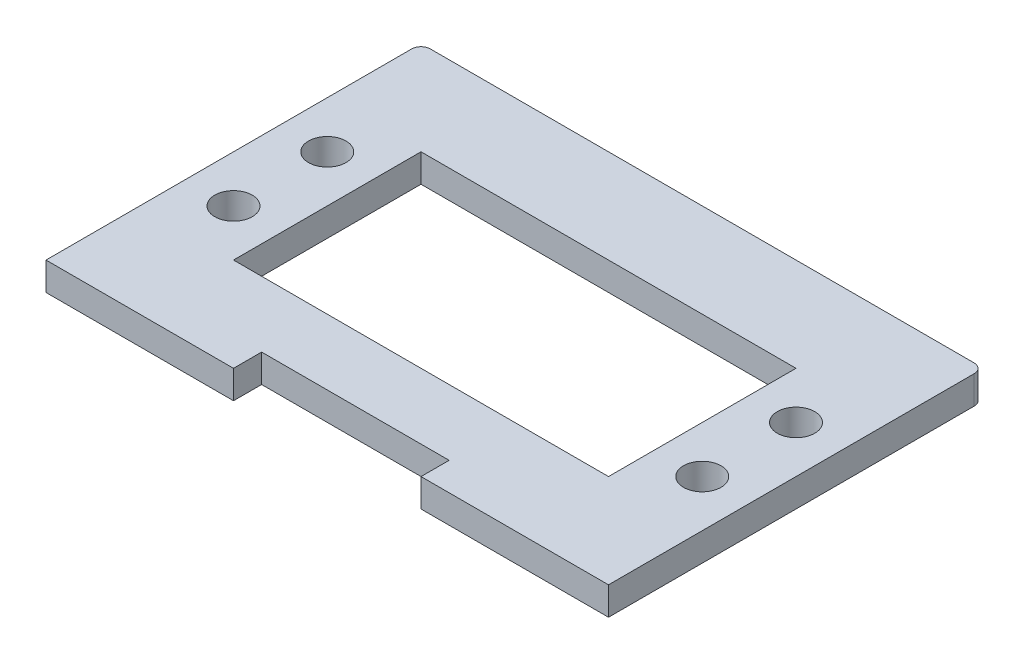
ISO-10303-21;
HEADER;
FILE_DESCRIPTION(('STEP AP214'),'2;1');
FILE_NAME('part.step','',(''),(''),'','','');
FILE_SCHEMA(('AUTOMOTIVE_DESIGN { 1 0 10303 214 1 1 1 1 }'));
ENDSEC;
DATA;
#1=APPLICATION_CONTEXT('core data for automotive mechanical design processes');
#2=APPLICATION_PROTOCOL_DEFINITION('international standard','automotive_design',2000,#1);
#3=PRODUCT_CONTEXT('',#1,'mechanical');
#4=PRODUCT('Part','Part','',(#3));
#5=PRODUCT_RELATED_PRODUCT_CATEGORY('part','',(#4));
#6=PRODUCT_DEFINITION_FORMATION('','',#4);
#7=PRODUCT_DEFINITION_CONTEXT('part definition',#1,'design');
#8=PRODUCT_DEFINITION('design','',#6,#7);
#9=PRODUCT_DEFINITION_SHAPE('','',#8);
#10=(LENGTH_UNIT() NAMED_UNIT(*) SI_UNIT(.MILLI.,.METRE.));
#11=(NAMED_UNIT(*) PLANE_ANGLE_UNIT() SI_UNIT($,.RADIAN.));
#12=(NAMED_UNIT(*) SI_UNIT($,.STERADIAN.) SOLID_ANGLE_UNIT());
#13=UNCERTAINTY_MEASURE_WITH_UNIT(LENGTH_MEASURE(1.E-05),#10,'distance_accuracy_value','');
#14=(GEOMETRIC_REPRESENTATION_CONTEXT(3) GLOBAL_UNCERTAINTY_ASSIGNED_CONTEXT((#13)) GLOBAL_UNIT_ASSIGNED_CONTEXT((#10,
#11,#12)) REPRESENTATION_CONTEXT('',''));
#15=CARTESIAN_POINT('',(0.,0.,0.));
#16=DIRECTION('',(0.,0.,1.));
#17=DIRECTION('',(1.,0.,0.));
#18=AXIS2_PLACEMENT_3D('',#15,#16,#17);
#19=CARTESIAN_POINT('',(30.,3.,20.));
#20=DIRECTION('',(0.,0.,-1.));
#21=DIRECTION('',(-1.,0.,0.));
#22=AXIS2_PLACEMENT_3D('',#19,#20,#21);
#23=PLANE('',#22);
#24=DIRECTION('',(1.,0.,0.));
#25=VECTOR('',#24,1.);
#26=CARTESIAN_POINT('',(30.,0.,20.));
#27=LINE('',#26,#25);
#28=CARTESIAN_POINT('',(-30.,0.,20.));
#29=VERTEX_POINT('',#28);
#30=CARTESIAN_POINT('',(-10.,0.,20.));
#31=VERTEX_POINT('',#30);
#32=EDGE_CURVE('E239',#29,#31,#27,.T.);
#33=ORIENTED_EDGE('',*,*,#32,.T.);
#34=DIRECTION('',(0.,1.,0.));
#35=VECTOR('',#34,1.);
#36=CARTESIAN_POINT('',(-10.,3.,20.));
#37=LINE('',#36,#35);
#38=CARTESIAN_POINT('',(-10.,3.,20.));
#39=VERTEX_POINT('',#38);
#40=EDGE_CURVE('E149',#31,#39,#37,.T.);
#41=ORIENTED_EDGE('',*,*,#40,.T.);
#42=DIRECTION('',(1.,0.,0.));
#43=VECTOR('',#42,1.);
#44=CARTESIAN_POINT('',(30.,3.,20.));
#45=LINE('',#44,#43);
#46=CARTESIAN_POINT('',(-30.,3.,20.));
#47=VERTEX_POINT('',#46);
#48=EDGE_CURVE('E228',#47,#39,#45,.T.);
#49=ORIENTED_EDGE('',*,*,#48,.F.);
#50=DIRECTION('',(0.,-1.,0.));
#51=VECTOR('',#50,1.);
#52=CARTESIAN_POINT('',(-30.,3.,20.));
#53=LINE('',#52,#51);
#54=EDGE_CURVE('E247',#47,#29,#53,.T.);
#55=ORIENTED_EDGE('',*,*,#54,.T.);
#56=EDGE_LOOP('',(#33,#41,#49,#55));
#57=FACE_BOUND('',#56,.T.);
#58=ADVANCED_FACE('F34',(#57),#23,.F.);
#59=CARTESIAN_POINT('',(-30.,3.,20.));
#60=DIRECTION('',(1.,0.,0.));
#61=DIRECTION('',(0.,0.,-1.));
#62=AXIS2_PLACEMENT_3D('',#59,#60,#61);
#63=PLANE('',#62);
#64=DIRECTION('',(0.,0.,1.));
#65=VECTOR('',#64,1.);
#66=CARTESIAN_POINT('',(-30.,3.,20.));
#67=LINE('',#66,#65);
#68=CARTESIAN_POINT('',(-30.,3.,-19.));
#69=VERTEX_POINT('',#68);
#70=EDGE_CURVE('E224',#69,#47,#67,.T.);
#71=ORIENTED_EDGE('',*,*,#70,.F.);
#72=DIRECTION('',(0.,-1.,0.));
#73=VECTOR('',#72,1.);
#74=CARTESIAN_POINT('',(-30.,3.,-19.));
#75=LINE('',#74,#73);
#76=CARTESIAN_POINT('',(-30.,0.,-19.));
#77=VERTEX_POINT('',#76);
#78=EDGE_CURVE('E250',#69,#77,#75,.T.);
#79=ORIENTED_EDGE('',*,*,#78,.T.);
#80=DIRECTION('',(0.,0.,1.));
#81=VECTOR('',#80,1.);
#82=CARTESIAN_POINT('',(-30.,0.,20.));
#83=LINE('',#82,#81);
#84=EDGE_CURVE('E217',#77,#29,#83,.T.);
#85=ORIENTED_EDGE('',*,*,#84,.T.);
#86=ORIENTED_EDGE('',*,*,#54,.F.);
#87=EDGE_LOOP('',(#71,#79,#85,#86));
#88=FACE_BOUND('',#87,.T.);
#89=ADVANCED_FACE('F277',(#88),#63,.F.);
#90=CARTESIAN_POINT('',(10.,3.,20.));
#91=VERTEX_POINT('',#90);
#92=CARTESIAN_POINT('',(30.,3.,20.));
#93=VERTEX_POINT('',#92);
#94=EDGE_CURVE('E226',#91,#93,#45,.T.);
#95=ORIENTED_EDGE('',*,*,#94,.F.);
#96=DIRECTION('',(0.,-1.,0.));
#97=VECTOR('',#96,1.);
#98=CARTESIAN_POINT('',(10.,3.,20.));
#99=LINE('',#98,#97);
#100=CARTESIAN_POINT('',(10.,0.,20.));
#101=VERTEX_POINT('',#100);
#102=EDGE_CURVE('E142',#91,#101,#99,.T.);
#103=ORIENTED_EDGE('',*,*,#102,.T.);
#104=CARTESIAN_POINT('',(30.,0.,20.));
#105=VERTEX_POINT('',#104);
#106=EDGE_CURVE('E238',#101,#105,#27,.T.);
#107=ORIENTED_EDGE('',*,*,#106,.T.);
#108=DIRECTION('',(0.,-1.,0.));
#109=VECTOR('',#108,1.);
#110=CARTESIAN_POINT('',(30.,3.,20.));
#111=LINE('',#110,#109);
#112=EDGE_CURVE('E236',#93,#105,#111,.T.);
#113=ORIENTED_EDGE('',*,*,#112,.F.);
#114=EDGE_LOOP('',(#95,#103,#107,#113));
#115=FACE_BOUND('',#114,.T.);
#116=ADVANCED_FACE('F291',(#115),#23,.F.);
#117=CARTESIAN_POINT('',(30.,3.,20.));
#118=DIRECTION('',(-1.,0.,0.));
#119=DIRECTION('',(0.,0.,1.));
#120=AXIS2_PLACEMENT_3D('',#117,#118,#119);
#121=PLANE('',#120);
#122=DIRECTION('',(0.,0.,-1.));
#123=VECTOR('',#122,1.);
#124=CARTESIAN_POINT('',(30.,0.,20.));
#125=LINE('',#124,#123);
#126=CARTESIAN_POINT('',(30.,0.,-19.));
#127=VERTEX_POINT('',#126);
#128=EDGE_CURVE('E241',#105,#127,#125,.T.);
#129=ORIENTED_EDGE('',*,*,#128,.T.);
#130=DIRECTION('',(0.,-1.,0.));
#131=VECTOR('',#130,1.);
#132=CARTESIAN_POINT('',(30.,3.,-19.));
#133=LINE('',#132,#131);
#134=CARTESIAN_POINT('',(30.,3.,-19.));
#135=VERTEX_POINT('',#134);
#136=EDGE_CURVE('E42',#127,#135,#133,.F.);
#137=ORIENTED_EDGE('',*,*,#136,.T.);
#138=DIRECTION('',(0.,0.,-1.));
#139=VECTOR('',#138,1.);
#140=CARTESIAN_POINT('',(30.,3.,20.));
#141=LINE('',#140,#139);
#142=EDGE_CURVE('E231',#93,#135,#141,.T.);
#143=ORIENTED_EDGE('',*,*,#142,.F.);
#144=ORIENTED_EDGE('',*,*,#112,.T.);
#145=EDGE_LOOP('',(#129,#137,#143,#144));
#146=FACE_BOUND('',#145,.T.);
#147=ADVANCED_FACE('F287',(#146),#121,.F.);
#148=CARTESIAN_POINT('',(30.,3.,-20.));
#149=DIRECTION('',(0.,0.,1.));
#150=DIRECTION('',(1.,0.,0.));
#151=AXIS2_PLACEMENT_3D('',#148,#149,#150);
#152=PLANE('',#151);
#153=DIRECTION('',(-1.,0.,0.));
#154=VECTOR('',#153,1.);
#155=CARTESIAN_POINT('',(30.,0.,-20.));
#156=LINE('',#155,#154);
#157=CARTESIAN_POINT('',(29.,0.,-20.));
#158=VERTEX_POINT('',#157);
#159=CARTESIAN_POINT('',(-29.,0.,-20.));
#160=VERTEX_POINT('',#159);
#161=EDGE_CURVE('E227',#158,#160,#156,.T.);
#162=ORIENTED_EDGE('',*,*,#161,.T.);
#163=DIRECTION('',(0.,-1.,0.));
#164=VECTOR('',#163,1.);
#165=CARTESIAN_POINT('',(-29.,3.,-20.));
#166=LINE('',#165,#164);
#167=CARTESIAN_POINT('',(-29.,3.,-20.));
#168=VERTEX_POINT('',#167);
#169=EDGE_CURVE('E260',#160,#168,#166,.F.);
#170=ORIENTED_EDGE('',*,*,#169,.T.);
#171=DIRECTION('',(-1.,0.,0.));
#172=VECTOR('',#171,1.);
#173=CARTESIAN_POINT('',(30.,3.,-20.));
#174=LINE('',#173,#172);
#175=CARTESIAN_POINT('',(29.,3.,-20.));
#176=VERTEX_POINT('',#175);
#177=EDGE_CURVE('E233',#176,#168,#174,.T.);
#178=ORIENTED_EDGE('',*,*,#177,.F.);
#179=DIRECTION('',(0.,-1.,0.));
#180=VECTOR('',#179,1.);
#181=CARTESIAN_POINT('',(29.,3.,-20.));
#182=LINE('',#181,#180);
#183=EDGE_CURVE('E257',#176,#158,#182,.T.);
#184=ORIENTED_EDGE('',*,*,#183,.T.);
#185=EDGE_LOOP('',(#162,#170,#178,#184));
#186=FACE_BOUND('',#185,.T.);
#187=ADVANCED_FACE('F282',(#186),#152,.F.);
#188=CARTESIAN_POINT('',(0.,3.,0.));
#189=DIRECTION('',(0.,1.,0.));
#190=DIRECTION('',(0.,0.,1.));
#191=AXIS2_PLACEMENT_3D('',#188,#189,#190);
#192=PLANE('',#191);
#193=DIRECTION('',(0.,0.,1.));
#194=VECTOR('',#193,1.);
#195=CARTESIAN_POINT('',(-10.,3.,23.));
#196=LINE('',#195,#194);
#197=CARTESIAN_POINT('',(-10.,3.,17.));
#198=VERTEX_POINT('',#197);
#199=EDGE_CURVE('E159',#198,#39,#196,.T.);
#200=ORIENTED_EDGE('',*,*,#199,.F.);
#201=DIRECTION('',(-1.,0.,0.));
#202=VECTOR('',#201,1.);
#203=CARTESIAN_POINT('',(10.,3.,17.));
#204=LINE('',#203,#202);
#205=CARTESIAN_POINT('',(10.,3.,17.));
#206=VERTEX_POINT('',#205);
#207=EDGE_CURVE('E139',#206,#198,#204,.T.);
#208=ORIENTED_EDGE('',*,*,#207,.F.);
#209=DIRECTION('',(0.,0.,-1.));
#210=VECTOR('',#209,1.);
#211=CARTESIAN_POINT('',(10.,3.,23.));
#212=LINE('',#211,#210);
#213=EDGE_CURVE('E161',#91,#206,#212,.T.);
#214=ORIENTED_EDGE('',*,*,#213,.F.);
#215=ORIENTED_EDGE('',*,*,#94,.T.);
#216=ORIENTED_EDGE('',*,*,#142,.T.);
#217=CARTESIAN_POINT('',(29.,3.,-19.));
#218=DIRECTION('',(0.,1.,0.));
#219=DIRECTION('',(0.,0.,1.));
#220=AXIS2_PLACEMENT_3D('',#217,#218,#219);
#221=CIRCLE('',#220,1.);
#222=EDGE_CURVE('E262',#135,#176,#221,.T.);
#223=ORIENTED_EDGE('',*,*,#222,.T.);
#224=ORIENTED_EDGE('',*,*,#177,.T.);
#225=CARTESIAN_POINT('',(-29.,3.,-19.));
#226=DIRECTION('',(0.,1.,0.));
#227=DIRECTION('',(0.,0.,1.));
#228=AXIS2_PLACEMENT_3D('',#225,#226,#227);
#229=CIRCLE('',#228,1.);
#230=EDGE_CURVE('E264',#168,#69,#229,.T.);
#231=ORIENTED_EDGE('',*,*,#230,.T.);
#232=ORIENTED_EDGE('',*,*,#70,.T.);
#233=ORIENTED_EDGE('',*,*,#48,.T.);
#234=EDGE_LOOP('',(#200,#208,#214,#215,#216,#223,#224,#231,#232,#233));
#235=FACE_BOUND('',#234,.T.);
#236=CARTESIAN_POINT('',(-25.,3.,-5.));
#237=DIRECTION('',(0.,1.,0.));
#238=DIRECTION('',(0.,0.,-1.));
#239=AXIS2_PLACEMENT_3D('',#236,#237,#238);
#240=CIRCLE('',#239,2.);
#241=CARTESIAN_POINT('',(-25.,3.,-7.));
#242=VERTEX_POINT('',#241);
#243=EDGE_CURVE('E167',#242,#242,#240,.T.);
#244=ORIENTED_EDGE('',*,*,#243,.F.);
#245=EDGE_LOOP('',(#244));
#246=FACE_BOUND('',#245,.T.);
#247=CARTESIAN_POINT('',(-25.,3.,5.00000000000001));
#248=DIRECTION('',(0.,1.,0.));
#249=DIRECTION('',(0.,0.,1.));
#250=AXIS2_PLACEMENT_3D('',#247,#248,#249);
#251=CIRCLE('',#250,2.);
#252=CARTESIAN_POINT('',(-25.,3.,7.00000000000002));
#253=VERTEX_POINT('',#252);
#254=EDGE_CURVE('E171',#253,#253,#251,.T.);
#255=ORIENTED_EDGE('',*,*,#254,.F.);
#256=EDGE_LOOP('',(#255));
#257=FACE_BOUND('',#256,.T.);
#258=CARTESIAN_POINT('',(25.,3.,5.00000000000001));
#259=DIRECTION('',(0.,1.,0.));
#260=DIRECTION('',(0.,0.,-1.));
#261=AXIS2_PLACEMENT_3D('',#258,#259,#260);
#262=CIRCLE('',#261,2.);
#263=CARTESIAN_POINT('',(25.,3.,3.));
#264=VERTEX_POINT('',#263);
#265=EDGE_CURVE('E177',#264,#264,#262,.T.);
#266=ORIENTED_EDGE('',*,*,#265,.F.);
#267=EDGE_LOOP('',(#266));
#268=FACE_BOUND('',#267,.T.);
#269=CARTESIAN_POINT('',(25.,3.,-5.));
#270=DIRECTION('',(0.,1.,0.));
#271=DIRECTION('',(0.,0.,1.));
#272=AXIS2_PLACEMENT_3D('',#269,#270,#271);
#273=CIRCLE('',#272,2.);
#274=CARTESIAN_POINT('',(25.,3.,-3.));
#275=VERTEX_POINT('',#274);
#276=EDGE_CURVE('E183',#275,#275,#273,.T.);
#277=ORIENTED_EDGE('',*,*,#276,.F.);
#278=EDGE_LOOP('',(#277));
#279=FACE_BOUND('',#278,.T.);
#280=DIRECTION('',(0.,0.,1.));
#281=VECTOR('',#280,1.);
#282=CARTESIAN_POINT('',(-20.,3.,10.));
#283=LINE('',#282,#281);
#284=CARTESIAN_POINT('',(-20.,3.,-10.));
#285=VERTEX_POINT('',#284);
#286=CARTESIAN_POINT('',(-20.,3.,10.));
#287=VERTEX_POINT('',#286);
#288=EDGE_CURVE('E189',#285,#287,#283,.T.);
#289=ORIENTED_EDGE('',*,*,#288,.F.);
#290=DIRECTION('',(-1.,0.,0.));
#291=VECTOR('',#290,1.);
#292=CARTESIAN_POINT('',(20.,3.,-10.));
#293=LINE('',#292,#291);
#294=CARTESIAN_POINT('',(20.,3.,-10.));
#295=VERTEX_POINT('',#294);
#296=EDGE_CURVE('E196',#295,#285,#293,.T.);
#297=ORIENTED_EDGE('',*,*,#296,.F.);
#298=DIRECTION('',(0.,0.,-1.));
#299=VECTOR('',#298,1.);
#300=CARTESIAN_POINT('',(20.,3.,10.));
#301=LINE('',#300,#299);
#302=CARTESIAN_POINT('',(20.,3.,10.));
#303=VERTEX_POINT('',#302);
#304=EDGE_CURVE('E210',#303,#295,#301,.T.);
#305=ORIENTED_EDGE('',*,*,#304,.F.);
#306=DIRECTION('',(1.,0.,0.));
#307=VECTOR('',#306,1.);
#308=CARTESIAN_POINT('',(20.,3.,10.));
#309=LINE('',#308,#307);
#310=EDGE_CURVE('E207',#287,#303,#309,.T.);
#311=ORIENTED_EDGE('',*,*,#310,.F.);
#312=EDGE_LOOP('',(#289,#297,#305,#311));
#313=FACE_BOUND('',#312,.T.);
#314=ADVANCED_FACE('F268',(#235,#246,#257,#268,#279,#313),#192,.T.);
#315=CARTESIAN_POINT('',(0.,0.,0.));
#316=DIRECTION('',(0.,1.,0.));
#317=DIRECTION('',(0.,0.,1.));
#318=AXIS2_PLACEMENT_3D('',#315,#316,#317);
#319=PLANE('',#318);
#320=CARTESIAN_POINT('',(-25.,0.,-5.));
#321=DIRECTION('',(0.,1.,0.));
#322=DIRECTION('',(0.,0.,-1.));
#323=AXIS2_PLACEMENT_3D('',#320,#321,#322);
#324=CIRCLE('',#323,2.);
#325=CARTESIAN_POINT('',(-25.,0.,-7.));
#326=VERTEX_POINT('',#325);
#327=EDGE_CURVE('E168',#326,#326,#324,.T.);
#328=ORIENTED_EDGE('',*,*,#327,.T.);
#329=EDGE_LOOP('',(#328));
#330=FACE_BOUND('',#329,.T.);
#331=CARTESIAN_POINT('',(-25.,0.,5.00000000000001));
#332=DIRECTION('',(0.,1.,0.));
#333=DIRECTION('',(0.,0.,1.));
#334=AXIS2_PLACEMENT_3D('',#331,#332,#333);
#335=CIRCLE('',#334,2.);
#336=CARTESIAN_POINT('',(-25.,0.,7.00000000000002));
#337=VERTEX_POINT('',#336);
#338=EDGE_CURVE('E174',#337,#337,#335,.T.);
#339=ORIENTED_EDGE('',*,*,#338,.T.);
#340=EDGE_LOOP('',(#339));
#341=FACE_BOUND('',#340,.T.);
#342=CARTESIAN_POINT('',(25.,0.,5.00000000000001));
#343=DIRECTION('',(0.,1.,0.));
#344=DIRECTION('',(0.,0.,-1.));
#345=AXIS2_PLACEMENT_3D('',#342,#343,#344);
#346=CIRCLE('',#345,2.);
#347=CARTESIAN_POINT('',(25.,0.,3.));
#348=VERTEX_POINT('',#347);
#349=EDGE_CURVE('E180',#348,#348,#346,.T.);
#350=ORIENTED_EDGE('',*,*,#349,.T.);
#351=EDGE_LOOP('',(#350));
#352=FACE_BOUND('',#351,.T.);
#353=CARTESIAN_POINT('',(25.,0.,-5.));
#354=DIRECTION('',(0.,1.,0.));
#355=DIRECTION('',(0.,0.,1.));
#356=AXIS2_PLACEMENT_3D('',#353,#354,#355);
#357=CIRCLE('',#356,2.);
#358=CARTESIAN_POINT('',(25.,0.,-3.));
#359=VERTEX_POINT('',#358);
#360=EDGE_CURVE('E186',#359,#359,#357,.T.);
#361=ORIENTED_EDGE('',*,*,#360,.T.);
#362=EDGE_LOOP('',(#361));
#363=FACE_BOUND('',#362,.T.);
#364=DIRECTION('',(-1.,0.,0.));
#365=VECTOR('',#364,1.);
#366=CARTESIAN_POINT('',(20.,0.,-10.));
#367=LINE('',#366,#365);
#368=CARTESIAN_POINT('',(20.,0.,-10.));
#369=VERTEX_POINT('',#368);
#370=CARTESIAN_POINT('',(-20.,0.,-10.));
#371=VERTEX_POINT('',#370);
#372=EDGE_CURVE('E202',#369,#371,#367,.T.);
#373=ORIENTED_EDGE('',*,*,#372,.T.);
#374=DIRECTION('',(0.,0.,1.));
#375=VECTOR('',#374,1.);
#376=CARTESIAN_POINT('',(-20.,0.,10.));
#377=LINE('',#376,#375);
#378=CARTESIAN_POINT('',(-20.,0.,10.));
#379=VERTEX_POINT('',#378);
#380=EDGE_CURVE('E192',#371,#379,#377,.T.);
#381=ORIENTED_EDGE('',*,*,#380,.T.);
#382=DIRECTION('',(1.,0.,0.));
#383=VECTOR('',#382,1.);
#384=CARTESIAN_POINT('',(20.,0.,10.));
#385=LINE('',#384,#383);
#386=CARTESIAN_POINT('',(20.,0.,10.));
#387=VERTEX_POINT('',#386);
#388=EDGE_CURVE('E195',#379,#387,#385,.T.);
#389=ORIENTED_EDGE('',*,*,#388,.T.);
#390=DIRECTION('',(0.,0.,-1.));
#391=VECTOR('',#390,1.);
#392=CARTESIAN_POINT('',(20.,0.,10.));
#393=LINE('',#392,#391);
#394=EDGE_CURVE('E199',#387,#369,#393,.T.);
#395=ORIENTED_EDGE('',*,*,#394,.T.);
#396=EDGE_LOOP('',(#373,#381,#389,#395));
#397=FACE_BOUND('',#396,.T.);
#398=DIRECTION('',(-1.,0.,0.));
#399=VECTOR('',#398,1.);
#400=CARTESIAN_POINT('',(10.,0.,17.));
#401=LINE('',#400,#399);
#402=CARTESIAN_POINT('',(10.,0.,17.));
#403=VERTEX_POINT('',#402);
#404=CARTESIAN_POINT('',(-10.,0.,17.));
#405=VERTEX_POINT('',#404);
#406=EDGE_CURVE('E49',#403,#405,#401,.T.);
#407=ORIENTED_EDGE('',*,*,#406,.T.);
#408=DIRECTION('',(0.,0.,1.));
#409=VECTOR('',#408,1.);
#410=CARTESIAN_POINT('',(-10.,0.,23.));
#411=LINE('',#410,#409);
#412=EDGE_CURVE('E146',#405,#31,#411,.T.);
#413=ORIENTED_EDGE('',*,*,#412,.T.);
#414=ORIENTED_EDGE('',*,*,#32,.F.);
#415=ORIENTED_EDGE('',*,*,#84,.F.);
#416=CARTESIAN_POINT('',(-29.,0.,-19.));
#417=DIRECTION('',(0.,1.,0.));
#418=DIRECTION('',(0.,0.,1.));
#419=AXIS2_PLACEMENT_3D('',#416,#417,#418);
#420=CIRCLE('',#419,1.);
#421=EDGE_CURVE('E255',#77,#160,#420,.F.);
#422=ORIENTED_EDGE('',*,*,#421,.T.);
#423=ORIENTED_EDGE('',*,*,#161,.F.);
#424=CARTESIAN_POINT('',(29.,0.,-19.));
#425=DIRECTION('',(0.,1.,0.));
#426=DIRECTION('',(0.,0.,1.));
#427=AXIS2_PLACEMENT_3D('',#424,#425,#426);
#428=CIRCLE('',#427,1.);
#429=EDGE_CURVE('E253',#158,#127,#428,.F.);
#430=ORIENTED_EDGE('',*,*,#429,.T.);
#431=ORIENTED_EDGE('',*,*,#128,.F.);
#432=ORIENTED_EDGE('',*,*,#106,.F.);
#433=DIRECTION('',(0.,0.,-1.));
#434=VECTOR('',#433,1.);
#435=CARTESIAN_POINT('',(10.,0.,0.));
#436=LINE('',#435,#434);
#437=EDGE_CURVE('E11',#101,#403,#436,.T.);
#438=ORIENTED_EDGE('',*,*,#437,.T.);
#439=EDGE_LOOP('',(#407,#413,#414,#415,#422,#423,#430,#431,#432,#438));
#440=FACE_BOUND('',#439,.T.);
#441=ADVANCED_FACE('F154',(#330,#341,#352,#363,#397,#440),#319,.F.);
#442=CARTESIAN_POINT('',(-20.,0.,10.));
#443=DIRECTION('',(-1.,0.,0.));
#444=DIRECTION('',(0.,0.,1.));
#445=AXIS2_PLACEMENT_3D('',#442,#443,#444);
#446=PLANE('',#445);
#447=ORIENTED_EDGE('',*,*,#288,.T.);
#448=DIRECTION('',(0.,1.,0.));
#449=VECTOR('',#448,1.);
#450=CARTESIAN_POINT('',(-20.,0.,10.));
#451=LINE('',#450,#449);
#452=EDGE_CURVE('E205',#379,#287,#451,.T.);
#453=ORIENTED_EDGE('',*,*,#452,.F.);
#454=ORIENTED_EDGE('',*,*,#380,.F.);
#455=DIRECTION('',(0.,1.,0.));
#456=VECTOR('',#455,1.);
#457=CARTESIAN_POINT('',(-20.,0.,-10.));
#458=LINE('',#457,#456);
#459=EDGE_CURVE('E215',#371,#285,#458,.T.);
#460=ORIENTED_EDGE('',*,*,#459,.T.);
#461=EDGE_LOOP('',(#447,#453,#454,#460));
#462=FACE_BOUND('',#461,.T.);
#463=ADVANCED_FACE('F314',(#462),#446,.F.);
#464=CARTESIAN_POINT('',(20.,0.,-10.));
#465=DIRECTION('',(0.,0.,-1.));
#466=DIRECTION('',(-1.,0.,0.));
#467=AXIS2_PLACEMENT_3D('',#464,#465,#466);
#468=PLANE('',#467);
#469=ORIENTED_EDGE('',*,*,#296,.T.);
#470=ORIENTED_EDGE('',*,*,#459,.F.);
#471=ORIENTED_EDGE('',*,*,#372,.F.);
#472=DIRECTION('',(0.,1.,0.));
#473=VECTOR('',#472,1.);
#474=CARTESIAN_POINT('',(20.,0.,-10.));
#475=LINE('',#474,#473);
#476=EDGE_CURVE('E218',#369,#295,#475,.T.);
#477=ORIENTED_EDGE('',*,*,#476,.T.);
#478=EDGE_LOOP('',(#469,#470,#471,#477));
#479=FACE_BOUND('',#478,.T.);
#480=ADVANCED_FACE('F320',(#479),#468,.F.);
#481=CARTESIAN_POINT('',(20.,0.,10.));
#482=DIRECTION('',(1.,0.,0.));
#483=DIRECTION('',(0.,0.,-1.));
#484=AXIS2_PLACEMENT_3D('',#481,#482,#483);
#485=PLANE('',#484);
#486=ORIENTED_EDGE('',*,*,#304,.T.);
#487=ORIENTED_EDGE('',*,*,#476,.F.);
#488=ORIENTED_EDGE('',*,*,#394,.F.);
#489=DIRECTION('',(0.,1.,0.));
#490=VECTOR('',#489,1.);
#491=CARTESIAN_POINT('',(20.,0.,10.));
#492=LINE('',#491,#490);
#493=EDGE_CURVE('E220',#387,#303,#492,.T.);
#494=ORIENTED_EDGE('',*,*,#493,.T.);
#495=EDGE_LOOP('',(#486,#487,#488,#494));
#496=FACE_BOUND('',#495,.T.);
#497=ADVANCED_FACE('F326',(#496),#485,.F.);
#498=CARTESIAN_POINT('',(20.,0.,10.));
#499=DIRECTION('',(0.,0.,1.));
#500=DIRECTION('',(1.,0.,0.));
#501=AXIS2_PLACEMENT_3D('',#498,#499,#500);
#502=PLANE('',#501);
#503=ORIENTED_EDGE('',*,*,#310,.T.);
#504=ORIENTED_EDGE('',*,*,#493,.F.);
#505=ORIENTED_EDGE('',*,*,#388,.F.);
#506=ORIENTED_EDGE('',*,*,#452,.T.);
#507=EDGE_LOOP('',(#503,#504,#505,#506));
#508=FACE_BOUND('',#507,.T.);
#509=ADVANCED_FACE('F322',(#508),#502,.F.);
#510=CARTESIAN_POINT('',(25.,0.,-5.));
#511=DIRECTION('',(0.,1.,0.));
#512=DIRECTION('',(0.,0.,1.));
#513=AXIS2_PLACEMENT_3D('',#510,#511,#512);
#514=CYLINDRICAL_SURFACE('',#513,2.);
#515=ORIENTED_EDGE('',*,*,#360,.F.);
#516=EDGE_LOOP('',(#515));
#517=FACE_BOUND('',#516,.T.);
#518=ORIENTED_EDGE('',*,*,#276,.T.);
#519=EDGE_LOOP('',(#518));
#520=FACE_BOUND('',#519,.T.);
#521=ADVANCED_FACE('F325',(#517,#520),#514,.F.);
#522=CARTESIAN_POINT('',(25.,0.,5.00000000000001));
#523=DIRECTION('',(0.,1.,0.));
#524=DIRECTION('',(0.,0.,1.));
#525=AXIS2_PLACEMENT_3D('',#522,#523,#524);
#526=CYLINDRICAL_SURFACE('',#525,2.);
#527=ORIENTED_EDGE('',*,*,#349,.F.);
#528=EDGE_LOOP('',(#527));
#529=FACE_BOUND('',#528,.T.);
#530=ORIENTED_EDGE('',*,*,#265,.T.);
#531=EDGE_LOOP('',(#530));
#532=FACE_BOUND('',#531,.T.);
#533=ADVANCED_FACE('F336',(#529,#532),#526,.F.);
#534=CARTESIAN_POINT('',(-25.,0.,5.00000000000001));
#535=DIRECTION('',(0.,1.,0.));
#536=DIRECTION('',(0.,0.,1.));
#537=AXIS2_PLACEMENT_3D('',#534,#535,#536);
#538=CYLINDRICAL_SURFACE('',#537,2.);
#539=ORIENTED_EDGE('',*,*,#338,.F.);
#540=EDGE_LOOP('',(#539));
#541=FACE_BOUND('',#540,.T.);
#542=ORIENTED_EDGE('',*,*,#254,.T.);
#543=EDGE_LOOP('',(#542));
#544=FACE_BOUND('',#543,.T.);
#545=ADVANCED_FACE('F340',(#541,#544),#538,.F.);
#546=CARTESIAN_POINT('',(-25.,0.,-5.));
#547=DIRECTION('',(0.,1.,0.));
#548=DIRECTION('',(0.,0.,1.));
#549=AXIS2_PLACEMENT_3D('',#546,#547,#548);
#550=CYLINDRICAL_SURFACE('',#549,2.);
#551=ORIENTED_EDGE('',*,*,#327,.F.);
#552=EDGE_LOOP('',(#551));
#553=FACE_BOUND('',#552,.T.);
#554=ORIENTED_EDGE('',*,*,#243,.T.);
#555=EDGE_LOOP('',(#554));
#556=FACE_BOUND('',#555,.T.);
#557=ADVANCED_FACE('F344',(#553,#556),#550,.F.);
#558=CARTESIAN_POINT('',(-29.,3.,-19.));
#559=DIRECTION('',(0.,-1.,0.));
#560=DIRECTION('',(0.,0.,-1.));
#561=AXIS2_PLACEMENT_3D('',#558,#559,#560);
#562=CYLINDRICAL_SURFACE('',#561,1.);
#563=ORIENTED_EDGE('',*,*,#230,.F.);
#564=ORIENTED_EDGE('',*,*,#169,.F.);
#565=ORIENTED_EDGE('',*,*,#421,.F.);
#566=ORIENTED_EDGE('',*,*,#78,.F.);
#567=EDGE_LOOP('',(#563,#564,#565,#566));
#568=FACE_BOUND('',#567,.T.);
#569=ADVANCED_FACE('F279',(#568),#562,.T.);
#570=CARTESIAN_POINT('',(29.,3.,-19.));
#571=DIRECTION('',(0.,-1.,0.));
#572=DIRECTION('',(0.,0.,-1.));
#573=AXIS2_PLACEMENT_3D('',#570,#571,#572);
#574=CYLINDRICAL_SURFACE('',#573,1.);
#575=ORIENTED_EDGE('',*,*,#222,.F.);
#576=ORIENTED_EDGE('',*,*,#136,.F.);
#577=ORIENTED_EDGE('',*,*,#429,.F.);
#578=ORIENTED_EDGE('',*,*,#183,.F.);
#579=EDGE_LOOP('',(#575,#576,#577,#578));
#580=FACE_BOUND('',#579,.T.);
#581=ADVANCED_FACE('F36',(#580),#574,.T.);
#582=CARTESIAN_POINT('',(-10.,0.,23.));
#583=DIRECTION('',(-1.,0.,0.));
#584=DIRECTION('',(0.,0.,1.));
#585=AXIS2_PLACEMENT_3D('',#582,#583,#584);
#586=PLANE('',#585);
#587=ORIENTED_EDGE('',*,*,#412,.F.);
#588=DIRECTION('',(0.,1.,0.));
#589=VECTOR('',#588,1.);
#590=CARTESIAN_POINT('',(-10.,0.,17.));
#591=LINE('',#590,#589);
#592=EDGE_CURVE('E135',#405,#198,#591,.T.);
#593=ORIENTED_EDGE('',*,*,#592,.T.);
#594=ORIENTED_EDGE('',*,*,#199,.T.);
#595=ORIENTED_EDGE('',*,*,#40,.F.);
#596=EDGE_LOOP('',(#587,#593,#594,#595));
#597=FACE_BOUND('',#596,.T.);
#598=ADVANCED_FACE('F147',(#597),#586,.F.);
#599=CARTESIAN_POINT('',(10.,0.,23.));
#600=DIRECTION('',(1.,0.,0.));
#601=DIRECTION('',(0.,0.,-1.));
#602=AXIS2_PLACEMENT_3D('',#599,#600,#601);
#603=PLANE('',#602);
#604=ORIENTED_EDGE('',*,*,#213,.T.);
#605=DIRECTION('',(0.,1.,0.));
#606=VECTOR('',#605,1.);
#607=CARTESIAN_POINT('',(10.,0.,17.));
#608=LINE('',#607,#606);
#609=EDGE_CURVE('E143',#403,#206,#608,.T.);
#610=ORIENTED_EDGE('',*,*,#609,.F.);
#611=ORIENTED_EDGE('',*,*,#437,.F.);
#612=ORIENTED_EDGE('',*,*,#102,.F.);
#613=EDGE_LOOP('',(#604,#610,#611,#612));
#614=FACE_BOUND('',#613,.T.);
#615=ADVANCED_FACE('F294',(#614),#603,.F.);
#616=CARTESIAN_POINT('',(10.,0.,17.));
#617=DIRECTION('',(0.,0.,-1.));
#618=DIRECTION('',(-1.,0.,0.));
#619=AXIS2_PLACEMENT_3D('',#616,#617,#618);
#620=PLANE('',#619);
#621=ORIENTED_EDGE('',*,*,#207,.T.);
#622=ORIENTED_EDGE('',*,*,#592,.F.);
#623=ORIENTED_EDGE('',*,*,#406,.F.);
#624=ORIENTED_EDGE('',*,*,#609,.T.);
#625=EDGE_LOOP('',(#621,#622,#623,#624));
#626=FACE_BOUND('',#625,.T.);
#627=ADVANCED_FACE('F137',(#626),#620,.F.);
#628=CLOSED_SHELL('',(#58,#89,#116,#147,#187,#314,#441,#463,#480,#497,#509,#521,#533,#545,#557,
#569,#581,#598,#615,#627));
#629=MANIFOLD_SOLID_BREP('B2',#628);
#630=ADVANCED_BREP_SHAPE_REPRESENTATION('',(#18,#629),#14);
#631=SHAPE_DEFINITION_REPRESENTATION(#9,#630);
ENDSEC;
END-ISO-10303-21;
